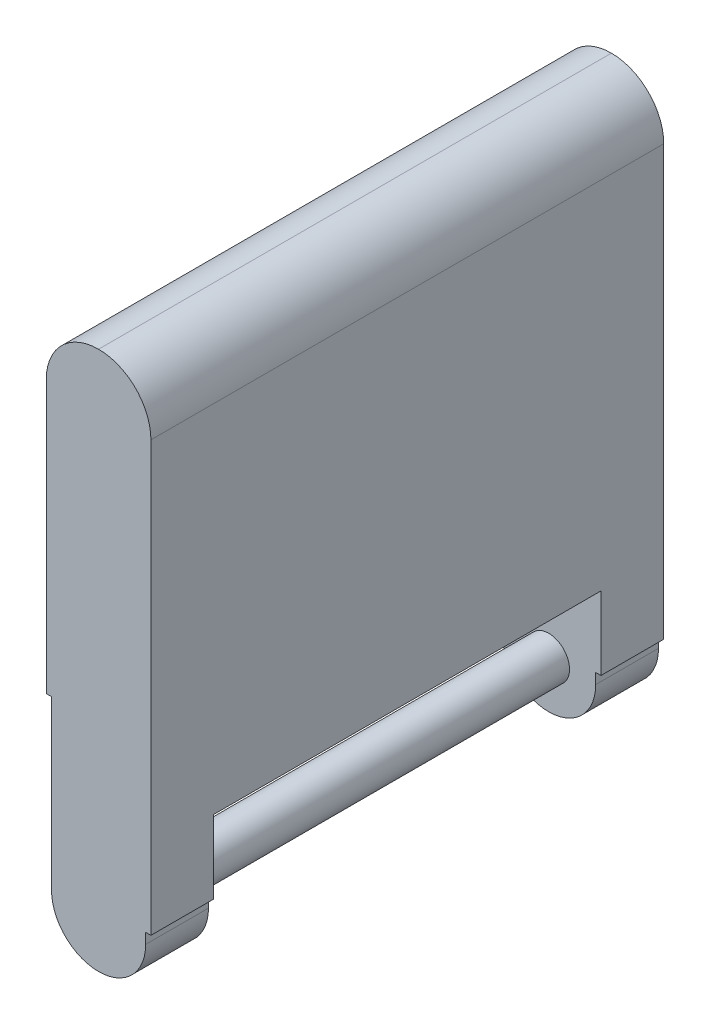
ISO-10303-21;
HEADER;
FILE_DESCRIPTION(('STEP AP214'),'2;1');
FILE_NAME('part.step','',(''),(''),'','','');
FILE_SCHEMA(('AUTOMOTIVE_DESIGN { 1 0 10303 214 1 1 1 1 }'));
ENDSEC;
DATA;
#1=APPLICATION_CONTEXT('core data for automotive mechanical design processes');
#2=APPLICATION_PROTOCOL_DEFINITION('international standard','automotive_design',2000,#1);
#3=PRODUCT_CONTEXT('',#1,'mechanical');
#4=PRODUCT('Part','Part','',(#3));
#5=PRODUCT_RELATED_PRODUCT_CATEGORY('part','',(#4));
#6=PRODUCT_DEFINITION_FORMATION('','',#4);
#7=PRODUCT_DEFINITION_CONTEXT('part definition',#1,'design');
#8=PRODUCT_DEFINITION('design','',#6,#7);
#9=PRODUCT_DEFINITION_SHAPE('','',#8);
#10=(LENGTH_UNIT() NAMED_UNIT(*) SI_UNIT(.MILLI.,.METRE.));
#11=(NAMED_UNIT(*) PLANE_ANGLE_UNIT() SI_UNIT($,.RADIAN.));
#12=(NAMED_UNIT(*) SI_UNIT($,.STERADIAN.) SOLID_ANGLE_UNIT());
#13=UNCERTAINTY_MEASURE_WITH_UNIT(LENGTH_MEASURE(1.E-05),#10,'distance_accuracy_value','');
#14=(GEOMETRIC_REPRESENTATION_CONTEXT(3) GLOBAL_UNCERTAINTY_ASSIGNED_CONTEXT((#13)) GLOBAL_UNIT_ASSIGNED_CONTEXT((#10,
#11,#12)) REPRESENTATION_CONTEXT('',''));
#15=CARTESIAN_POINT('',(0.,0.,0.));
#16=DIRECTION('',(0.,0.,1.));
#17=DIRECTION('',(1.,0.,0.));
#18=AXIS2_PLACEMENT_3D('',#15,#16,#17);
#19=CARTESIAN_POINT('',(-5.,0.,-24.5));
#20=DIRECTION('',(1.,0.,0.));
#21=DIRECTION('',(0.,1.,0.));
#22=AXIS2_PLACEMENT_3D('',#19,#20,#21);
#23=PLANE('',#22);
#24=DIRECTION('',(0.,1.,0.));
#25=VECTOR('',#24,1.);
#26=CARTESIAN_POINT('',(-5.,0.,-24.5));
#27=LINE('',#26,#25);
#28=CARTESIAN_POINT('',(-5.,18.7173913043478,-24.5));
#29=VERTEX_POINT('',#28);
#30=CARTESIAN_POINT('',(-5.,44.7173913043478,-24.5));
#31=VERTEX_POINT('',#30);
#32=EDGE_CURVE('E168',#29,#31,#27,.T.);
#33=ORIENTED_EDGE('',*,*,#32,.F.);
#34=DIRECTION('',(0.,0.,1.));
#35=VECTOR('',#34,1.);
#36=CARTESIAN_POINT('',(-5.,18.7173913043478,-24.5));
#37=LINE('',#36,#35);
#38=CARTESIAN_POINT('',(-5.,18.7173913043478,24.5));
#39=VERTEX_POINT('',#38);
#40=EDGE_CURVE('E231',#29,#39,#37,.T.);
#41=ORIENTED_EDGE('',*,*,#40,.T.);
#42=DIRECTION('',(0.,1.,0.));
#43=VECTOR('',#42,1.);
#44=CARTESIAN_POINT('',(-5.,0.,24.5));
#45=LINE('',#44,#43);
#46=CARTESIAN_POINT('',(-5.,44.7173913043478,24.5));
#47=VERTEX_POINT('',#46);
#48=EDGE_CURVE('E169',#39,#47,#45,.T.);
#49=ORIENTED_EDGE('',*,*,#48,.T.);
#50=DIRECTION('',(0.,0.,1.));
#51=VECTOR('',#50,1.);
#52=CARTESIAN_POINT('',(-5.,44.7173913043478,-24.5));
#53=LINE('',#52,#51);
#54=EDGE_CURVE('E189',#47,#31,#53,.F.);
#55=ORIENTED_EDGE('',*,*,#54,.T.);
#56=EDGE_LOOP('',(#33,#41,#49,#55));
#57=FACE_BOUND('',#56,.T.);
#58=ADVANCED_FACE('F33',(#57),#23,.F.);
#59=CARTESIAN_POINT('',(5.,0.,-24.5));
#60=DIRECTION('',(-1.,0.,0.));
#61=DIRECTION('',(0.,-1.,0.));
#62=AXIS2_PLACEMENT_3D('',#59,#60,#61);
#63=PLANE('',#62);
#64=DIRECTION('',(0.,-1.,0.));
#65=VECTOR('',#64,1.);
#66=CARTESIAN_POINT('',(5.,0.,24.5));
#67=LINE('',#66,#65);
#68=CARTESIAN_POINT('',(5.,44.7173913043478,24.5));
#69=VERTEX_POINT('',#68);
#70=CARTESIAN_POINT('',(5.,3.71739130434785,24.5));
#71=VERTEX_POINT('',#70);
#72=EDGE_CURVE('E173',#69,#71,#67,.T.);
#73=ORIENTED_EDGE('',*,*,#72,.T.);
#74=DIRECTION('',(0.,0.,1.));
#75=VECTOR('',#74,1.);
#76=CARTESIAN_POINT('',(5.,3.71739130434785,-24.5));
#77=LINE('',#76,#75);
#78=CARTESIAN_POINT('',(5.,3.71739130434785,18.5));
#79=VERTEX_POINT('',#78);
#80=EDGE_CURVE('E162',#79,#71,#77,.T.);
#81=ORIENTED_EDGE('',*,*,#80,.F.);
#82=DIRECTION('',(0.,1.,0.));
#83=VECTOR('',#82,1.);
#84=CARTESIAN_POINT('',(5.,0.,18.5));
#85=LINE('',#84,#83);
#86=CARTESIAN_POINT('',(5.,10.7173913043478,18.5));
#87=VERTEX_POINT('',#86);
#88=EDGE_CURVE('E243',#79,#87,#85,.T.);
#89=ORIENTED_EDGE('',*,*,#88,.T.);
#90=DIRECTION('',(0.,0.,1.));
#91=VECTOR('',#90,1.);
#92=CARTESIAN_POINT('',(5.,10.7173913043478,-18.5));
#93=LINE('',#92,#91);
#94=CARTESIAN_POINT('',(5.,10.7173913043478,-18.5));
#95=VERTEX_POINT('',#94);
#96=EDGE_CURVE('E176',#95,#87,#93,.T.);
#97=ORIENTED_EDGE('',*,*,#96,.F.);
#98=DIRECTION('',(0.,1.,0.));
#99=VECTOR('',#98,1.);
#100=CARTESIAN_POINT('',(5.,0.,-18.5));
#101=LINE('',#100,#99);
#102=CARTESIAN_POINT('',(5.,3.71739130434785,-18.5));
#103=VERTEX_POINT('',#102);
#104=EDGE_CURVE('E161',#103,#95,#101,.T.);
#105=ORIENTED_EDGE('',*,*,#104,.F.);
#106=CARTESIAN_POINT('',(5.,3.71739130434785,-24.5));
#107=VERTEX_POINT('',#106);
#108=EDGE_CURVE('E142',#107,#103,#77,.T.);
#109=ORIENTED_EDGE('',*,*,#108,.F.);
#110=DIRECTION('',(0.,-1.,0.));
#111=VECTOR('',#110,1.);
#112=CARTESIAN_POINT('',(5.,0.,-24.5));
#113=LINE('',#112,#111);
#114=CARTESIAN_POINT('',(5.,44.7173913043478,-24.5));
#115=VERTEX_POINT('',#114);
#116=EDGE_CURVE('E158',#115,#107,#113,.T.);
#117=ORIENTED_EDGE('',*,*,#116,.F.);
#118=DIRECTION('',(0.,0.,1.));
#119=VECTOR('',#118,1.);
#120=CARTESIAN_POINT('',(5.,44.7173913043478,-24.5));
#121=LINE('',#120,#119);
#122=EDGE_CURVE('E185',#115,#69,#121,.T.);
#123=ORIENTED_EDGE('',*,*,#122,.T.);
#124=EDGE_LOOP('',(#73,#81,#89,#97,#105,#109,#117,#123));
#125=FACE_BOUND('',#124,.T.);
#126=ADVANCED_FACE('F156',(#125),#63,.F.);
#127=CARTESIAN_POINT('',(0.,0.,-24.5));
#128=DIRECTION('',(0.,0.,1.));
#129=DIRECTION('',(1.,0.,0.));
#130=AXIS2_PLACEMENT_3D('',#127,#128,#129);
#131=PLANE('',#130);
#132=DIRECTION('',(0.,1.,0.));
#133=VECTOR('',#132,1.);
#134=CARTESIAN_POINT('',(-4.5,2.71739130434784,-24.5));
#135=LINE('',#134,#133);
#136=CARTESIAN_POINT('',(-4.5,2.71739130434784,-24.5));
#137=VERTEX_POINT('',#136);
#138=CARTESIAN_POINT('',(-4.5,18.7173913043478,-24.5));
#139=VERTEX_POINT('',#138);
#140=EDGE_CURVE('E259',#137,#139,#135,.T.);
#141=ORIENTED_EDGE('',*,*,#140,.T.);
#142=DIRECTION('',(-1.,0.,0.));
#143=VECTOR('',#142,1.);
#144=CARTESIAN_POINT('',(-4.5,18.7173913043478,-24.5));
#145=LINE('',#144,#143);
#146=EDGE_CURVE('E257',#139,#29,#145,.T.);
#147=ORIENTED_EDGE('',*,*,#146,.T.);
#148=ORIENTED_EDGE('',*,*,#32,.T.);
#149=CARTESIAN_POINT('',(0.,44.7173913043478,-24.5));
#150=DIRECTION('',(0.,0.,1.));
#151=DIRECTION('',(1.,0.,0.));
#152=AXIS2_PLACEMENT_3D('',#149,#150,#151);
#153=CIRCLE('',#152,5.);
#154=CARTESIAN_POINT('',(0.,49.7173913043478,-24.5));
#155=VERTEX_POINT('',#154);
#156=EDGE_CURVE('E56',#31,#155,#153,.F.);
#157=ORIENTED_EDGE('',*,*,#156,.T.);
#158=CARTESIAN_POINT('',(0.,44.7173913043478,-24.5));
#159=DIRECTION('',(0.,0.,1.));
#160=DIRECTION('',(1.,0.,0.));
#161=AXIS2_PLACEMENT_3D('',#158,#159,#160);
#162=CIRCLE('',#161,5.);
#163=EDGE_CURVE('E167',#155,#115,#162,.F.);
#164=ORIENTED_EDGE('',*,*,#163,.T.);
#165=ORIENTED_EDGE('',*,*,#116,.T.);
#166=DIRECTION('',(-1.,0.,0.));
#167=VECTOR('',#166,1.);
#168=CARTESIAN_POINT('',(4.5,3.71739130434785,-24.5));
#169=LINE('',#168,#167);
#170=CARTESIAN_POINT('',(4.5,3.71739130434785,-24.5));
#171=VERTEX_POINT('',#170);
#172=EDGE_CURVE('E139',#107,#171,#169,.T.);
#173=ORIENTED_EDGE('',*,*,#172,.T.);
#174=DIRECTION('',(0.,-1.,0.));
#175=VECTOR('',#174,1.);
#176=CARTESIAN_POINT('',(4.5,3.71739130434785,-24.5));
#177=LINE('',#176,#175);
#178=CARTESIAN_POINT('',(4.5,2.71739130434785,-24.5));
#179=VERTEX_POINT('',#178);
#180=EDGE_CURVE('E149',#171,#179,#177,.T.);
#181=ORIENTED_EDGE('',*,*,#180,.T.);
#182=CARTESIAN_POINT('',(0.,2.71739130434785,-24.5));
#183=DIRECTION('',(0.,0.,-1.));
#184=DIRECTION('',(1.,0.,0.));
#185=AXIS2_PLACEMENT_3D('',#182,#183,#184);
#186=CIRCLE('',#185,4.5);
#187=EDGE_CURVE('E263',#179,#137,#186,.T.);
#188=ORIENTED_EDGE('',*,*,#187,.T.);
#189=EDGE_LOOP('',(#141,#147,#148,#157,#164,#165,#173,#181,#188));
#190=FACE_BOUND('',#189,.T.);
#191=ADVANCED_FACE('F165',(#190),#131,.F.);
#192=CARTESIAN_POINT('',(0.,0.,24.5));
#193=DIRECTION('',(0.,0.,1.));
#194=DIRECTION('',(1.,0.,0.));
#195=AXIS2_PLACEMENT_3D('',#192,#193,#194);
#196=PLANE('',#195);
#197=DIRECTION('',(-1.,0.,0.));
#198=VECTOR('',#197,1.);
#199=CARTESIAN_POINT('',(-4.5,18.7173913043478,24.5));
#200=LINE('',#199,#198);
#201=CARTESIAN_POINT('',(-4.5,18.7173913043478,24.5));
#202=VERTEX_POINT('',#201);
#203=EDGE_CURVE('E150',#202,#39,#200,.T.);
#204=ORIENTED_EDGE('',*,*,#203,.F.);
#205=DIRECTION('',(0.,1.,0.));
#206=VECTOR('',#205,1.);
#207=CARTESIAN_POINT('',(-4.5,2.71739130434784,24.5));
#208=LINE('',#207,#206);
#209=CARTESIAN_POINT('',(-4.5,2.71739130434784,24.5));
#210=VERTEX_POINT('',#209);
#211=EDGE_CURVE('E272',#210,#202,#208,.T.);
#212=ORIENTED_EDGE('',*,*,#211,.F.);
#213=CARTESIAN_POINT('',(0.,2.71739130434785,24.5));
#214=DIRECTION('',(0.,0.,-1.));
#215=DIRECTION('',(1.,0.,0.));
#216=AXIS2_PLACEMENT_3D('',#213,#214,#215);
#217=CIRCLE('',#216,4.5);
#218=CARTESIAN_POINT('',(4.5,2.71739130434785,24.5));
#219=VERTEX_POINT('',#218);
#220=EDGE_CURVE('E270',#219,#210,#217,.T.);
#221=ORIENTED_EDGE('',*,*,#220,.F.);
#222=DIRECTION('',(0.,-1.,0.));
#223=VECTOR('',#222,1.);
#224=CARTESIAN_POINT('',(4.5,3.71739130434785,24.5));
#225=LINE('',#224,#223);
#226=CARTESIAN_POINT('',(4.5,3.71739130434785,24.5));
#227=VERTEX_POINT('',#226);
#228=EDGE_CURVE('E218',#227,#219,#225,.T.);
#229=ORIENTED_EDGE('',*,*,#228,.F.);
#230=DIRECTION('',(-1.,0.,0.));
#231=VECTOR('',#230,1.);
#232=CARTESIAN_POINT('',(4.5,3.71739130434785,24.5));
#233=LINE('',#232,#231);
#234=EDGE_CURVE('E267',#71,#227,#233,.T.);
#235=ORIENTED_EDGE('',*,*,#234,.F.);
#236=ORIENTED_EDGE('',*,*,#72,.F.);
#237=CARTESIAN_POINT('',(0.,44.7173913043478,24.5));
#238=DIRECTION('',(0.,0.,1.));
#239=DIRECTION('',(1.,0.,0.));
#240=AXIS2_PLACEMENT_3D('',#237,#238,#239);
#241=CIRCLE('',#240,5.);
#242=CARTESIAN_POINT('',(0.,49.7173913043478,24.5));
#243=VERTEX_POINT('',#242);
#244=EDGE_CURVE('E183',#69,#243,#241,.T.);
#245=ORIENTED_EDGE('',*,*,#244,.T.);
#246=CARTESIAN_POINT('',(0.,44.7173913043478,24.5));
#247=DIRECTION('',(0.,0.,1.));
#248=DIRECTION('',(1.,0.,0.));
#249=AXIS2_PLACEMENT_3D('',#246,#247,#248);
#250=CIRCLE('',#249,5.);
#251=EDGE_CURVE('E171',#243,#47,#250,.T.);
#252=ORIENTED_EDGE('',*,*,#251,.T.);
#253=ORIENTED_EDGE('',*,*,#48,.F.);
#254=EDGE_LOOP('',(#204,#212,#221,#229,#235,#236,#245,#252,#253));
#255=FACE_BOUND('',#254,.T.);
#256=ADVANCED_FACE('F287',(#255),#196,.T.);
#257=CARTESIAN_POINT('',(0.,44.7173913043478,-24.5));
#258=DIRECTION('',(0.,0.,1.));
#259=DIRECTION('',(1.,0.,0.));
#260=AXIS2_PLACEMENT_3D('',#257,#258,#259);
#261=CYLINDRICAL_SURFACE('',#260,5.);
#262=DIRECTION('',(0.,0.,1.));
#263=VECTOR('',#262,1.);
#264=CARTESIAN_POINT('',(0.,49.7173913043478,-24.5));
#265=LINE('',#264,#263);
#266=EDGE_CURVE('E179',#155,#243,#265,.T.);
#267=ORIENTED_EDGE('',*,*,#266,.F.);
#268=ORIENTED_EDGE('',*,*,#156,.F.);
#269=ORIENTED_EDGE('',*,*,#54,.F.);
#270=ORIENTED_EDGE('',*,*,#251,.F.);
#271=EDGE_LOOP('',(#267,#268,#269,#270));
#272=FACE_BOUND('',#271,.T.);
#273=ADVANCED_FACE('F35',(#272),#261,.T.);
#274=CARTESIAN_POINT('',(0.,44.7173913043478,-24.5));
#275=DIRECTION('',(0.,0.,1.));
#276=DIRECTION('',(1.,0.,0.));
#277=AXIS2_PLACEMENT_3D('',#274,#275,#276);
#278=CYLINDRICAL_SURFACE('',#277,5.);
#279=ORIENTED_EDGE('',*,*,#163,.F.);
#280=ORIENTED_EDGE('',*,*,#266,.T.);
#281=ORIENTED_EDGE('',*,*,#244,.F.);
#282=ORIENTED_EDGE('',*,*,#122,.F.);
#283=EDGE_LOOP('',(#279,#280,#281,#282));
#284=FACE_BOUND('',#283,.T.);
#285=ADVANCED_FACE('F295',(#284),#278,.T.);
#286=CARTESIAN_POINT('',(0.,10.7173913043478,-18.5));
#287=DIRECTION('',(0.,1.,0.));
#288=DIRECTION('',(0.,0.,1.));
#289=AXIS2_PLACEMENT_3D('',#286,#287,#288);
#290=PLANE('',#289);
#291=DIRECTION('',(-1.,0.,0.));
#292=VECTOR('',#291,1.);
#293=CARTESIAN_POINT('',(0.,10.7173913043478,18.5));
#294=LINE('',#293,#292);
#295=CARTESIAN_POINT('',(-4.5,10.7173913043478,18.5));
#296=VERTEX_POINT('',#295);
#297=EDGE_CURVE('E246',#87,#296,#294,.T.);
#298=ORIENTED_EDGE('',*,*,#297,.T.);
#299=DIRECTION('',(0.,0.,-1.));
#300=VECTOR('',#299,1.);
#301=CARTESIAN_POINT('',(-4.5,10.7173913043478,-18.5));
#302=LINE('',#301,#300);
#303=CARTESIAN_POINT('',(-4.5,10.7173913043478,-18.5));
#304=VERTEX_POINT('',#303);
#305=EDGE_CURVE('E235',#296,#304,#302,.T.);
#306=ORIENTED_EDGE('',*,*,#305,.T.);
#307=DIRECTION('',(-1.,0.,0.));
#308=VECTOR('',#307,1.);
#309=CARTESIAN_POINT('',(0.,10.7173913043478,-18.5));
#310=LINE('',#309,#308);
#311=EDGE_CURVE('E245',#95,#304,#310,.T.);
#312=ORIENTED_EDGE('',*,*,#311,.F.);
#313=ORIENTED_EDGE('',*,*,#96,.T.);
#314=EDGE_LOOP('',(#298,#306,#312,#313));
#315=FACE_BOUND('',#314,.T.);
#316=ADVANCED_FACE('F251',(#315),#290,.F.);
#317=CARTESIAN_POINT('',(0.,0.,-18.5));
#318=DIRECTION('',(0.,0.,1.));
#319=DIRECTION('',(1.,0.,0.));
#320=AXIS2_PLACEMENT_3D('',#317,#318,#319);
#321=PLANE('',#320);
#322=DIRECTION('',(0.,1.,0.));
#323=VECTOR('',#322,1.);
#324=CARTESIAN_POINT('',(-4.5,0.,-18.5));
#325=LINE('',#324,#323);
#326=CARTESIAN_POINT('',(-4.5,2.71739130434784,-18.5));
#327=VERTEX_POINT('',#326);
#328=EDGE_CURVE('E238',#327,#304,#325,.T.);
#329=ORIENTED_EDGE('',*,*,#328,.F.);
#330=CARTESIAN_POINT('',(0.,2.71739130434785,-18.5));
#331=DIRECTION('',(0.,0.,1.));
#332=DIRECTION('',(1.,0.,0.));
#333=AXIS2_PLACEMENT_3D('',#330,#331,#332);
#334=CIRCLE('',#333,4.5);
#335=CARTESIAN_POINT('',(4.5,2.71739130434785,-18.5));
#336=VERTEX_POINT('',#335);
#337=EDGE_CURVE('E233',#336,#327,#334,.F.);
#338=ORIENTED_EDGE('',*,*,#337,.F.);
#339=DIRECTION('',(0.,-1.,0.));
#340=VECTOR('',#339,1.);
#341=CARTESIAN_POINT('',(4.5,0.,-18.5));
#342=LINE('',#341,#340);
#343=CARTESIAN_POINT('',(4.5,3.71739130434785,-18.5));
#344=VERTEX_POINT('',#343);
#345=EDGE_CURVE('E230',#344,#336,#342,.T.);
#346=ORIENTED_EDGE('',*,*,#345,.F.);
#347=DIRECTION('',(-1.,0.,0.));
#348=VECTOR('',#347,1.);
#349=CARTESIAN_POINT('',(0.,3.71739130434784,-18.5));
#350=LINE('',#349,#348);
#351=EDGE_CURVE('E228',#103,#344,#350,.T.);
#352=ORIENTED_EDGE('',*,*,#351,.F.);
#353=ORIENTED_EDGE('',*,*,#104,.T.);
#354=ORIENTED_EDGE('',*,*,#311,.T.);
#355=EDGE_LOOP('',(#329,#338,#346,#352,#353,#354));
#356=FACE_BOUND('',#355,.T.);
#357=CARTESIAN_POINT('',(0.,2.71739130434785,-18.5));
#358=DIRECTION('',(0.,0.,1.));
#359=DIRECTION('',(1.,0.,0.));
#360=AXIS2_PLACEMENT_3D('',#357,#358,#359);
#361=CIRCLE('',#360,2.);
#362=CARTESIAN_POINT('',(2.,2.71739130434785,-18.5));
#363=VERTEX_POINT('',#362);
#364=EDGE_CURVE('E240',#363,#363,#361,.T.);
#365=ORIENTED_EDGE('',*,*,#364,.F.);
#366=EDGE_LOOP('',(#365));
#367=FACE_BOUND('',#366,.T.);
#368=ADVANCED_FACE('F321',(#356,#367),#321,.T.);
#369=CARTESIAN_POINT('',(0.,0.,18.5));
#370=DIRECTION('',(0.,0.,1.));
#371=DIRECTION('',(1.,0.,0.));
#372=AXIS2_PLACEMENT_3D('',#369,#370,#371);
#373=PLANE('',#372);
#374=CARTESIAN_POINT('',(0.,2.71739130434785,18.5));
#375=DIRECTION('',(0.,0.,1.));
#376=DIRECTION('',(1.,0.,0.));
#377=AXIS2_PLACEMENT_3D('',#374,#375,#376);
#378=CIRCLE('',#377,2.);
#379=CARTESIAN_POINT('',(2.,2.71739130434785,18.5));
#380=VERTEX_POINT('',#379);
#381=EDGE_CURVE('E192',#380,#380,#378,.F.);
#382=ORIENTED_EDGE('',*,*,#381,.F.);
#383=EDGE_LOOP('',(#382));
#384=FACE_BOUND('',#383,.T.);
#385=CARTESIAN_POINT('',(0.,2.71739130434785,18.5));
#386=DIRECTION('',(0.,0.,1.));
#387=DIRECTION('',(1.,0.,0.));
#388=AXIS2_PLACEMENT_3D('',#385,#386,#387);
#389=CIRCLE('',#388,4.5);
#390=CARTESIAN_POINT('',(4.5,2.71739130434785,18.5));
#391=VERTEX_POINT('',#390);
#392=CARTESIAN_POINT('',(-4.5,2.71739130434784,18.5));
#393=VERTEX_POINT('',#392);
#394=EDGE_CURVE('E41',#391,#393,#389,.F.);
#395=ORIENTED_EDGE('',*,*,#394,.T.);
#396=DIRECTION('',(0.,1.,0.));
#397=VECTOR('',#396,1.);
#398=CARTESIAN_POINT('',(-4.5,0.,18.5));
#399=LINE('',#398,#397);
#400=EDGE_CURVE('E11',#393,#296,#399,.T.);
#401=ORIENTED_EDGE('',*,*,#400,.T.);
#402=ORIENTED_EDGE('',*,*,#297,.F.);
#403=ORIENTED_EDGE('',*,*,#88,.F.);
#404=DIRECTION('',(-1.,0.,0.));
#405=VECTOR('',#404,1.);
#406=CARTESIAN_POINT('',(0.,3.71739130434784,18.5));
#407=LINE('',#406,#405);
#408=CARTESIAN_POINT('',(4.5,3.71739130434785,18.5));
#409=VERTEX_POINT('',#408);
#410=EDGE_CURVE('E197',#79,#409,#407,.T.);
#411=ORIENTED_EDGE('',*,*,#410,.T.);
#412=DIRECTION('',(0.,-1.,0.));
#413=VECTOR('',#412,1.);
#414=CARTESIAN_POINT('',(4.5,0.,18.5));
#415=LINE('',#414,#413);
#416=EDGE_CURVE('E200',#409,#391,#415,.T.);
#417=ORIENTED_EDGE('',*,*,#416,.T.);
#418=EDGE_LOOP('',(#395,#401,#402,#403,#411,#417));
#419=FACE_BOUND('',#418,.T.);
#420=ADVANCED_FACE('F204',(#384,#419),#373,.F.);
#421=CARTESIAN_POINT('',(0.,2.71739130434785,18.5));
#422=DIRECTION('',(0.,0.,-1.));
#423=DIRECTION('',(-1.,0.,0.));
#424=AXIS2_PLACEMENT_3D('',#421,#422,#423);
#425=CYLINDRICAL_SURFACE('',#424,2.);
#426=ORIENTED_EDGE('',*,*,#381,.T.);
#427=EDGE_LOOP('',(#426));
#428=FACE_BOUND('',#427,.T.);
#429=ORIENTED_EDGE('',*,*,#364,.T.);
#430=EDGE_LOOP('',(#429));
#431=FACE_BOUND('',#430,.T.);
#432=ADVANCED_FACE('F334',(#428,#431),#425,.T.);
#433=CARTESIAN_POINT('',(0.,2.71739130434785,-24.5));
#434=DIRECTION('',(0.,0.,1.));
#435=DIRECTION('',(1.,0.,0.));
#436=AXIS2_PLACEMENT_3D('',#433,#434,#435);
#437=CYLINDRICAL_SURFACE('',#436,4.5);
#438=DIRECTION('',(0.,0.,1.));
#439=VECTOR('',#438,1.);
#440=CARTESIAN_POINT('',(4.5,2.71739130434785,-24.5));
#441=LINE('',#440,#439);
#442=EDGE_CURVE('E212',#391,#219,#441,.T.);
#443=ORIENTED_EDGE('',*,*,#442,.T.);
#444=ORIENTED_EDGE('',*,*,#220,.T.);
#445=DIRECTION('',(0.,0.,1.));
#446=VECTOR('',#445,1.);
#447=CARTESIAN_POINT('',(-4.5,2.71739130434784,-24.5));
#448=LINE('',#447,#446);
#449=EDGE_CURVE('E214',#393,#210,#448,.T.);
#450=ORIENTED_EDGE('',*,*,#449,.F.);
#451=ORIENTED_EDGE('',*,*,#394,.F.);
#452=EDGE_LOOP('',(#443,#444,#450,#451));
#453=FACE_BOUND('',#452,.T.);
#454=ADVANCED_FACE('F210',(#453),#437,.T.);
#455=CARTESIAN_POINT('',(4.5,3.71739130434785,-24.5));
#456=DIRECTION('',(-1.,0.,0.));
#457=DIRECTION('',(0.,0.,1.));
#458=AXIS2_PLACEMENT_3D('',#455,#456,#457);
#459=PLANE('',#458);
#460=DIRECTION('',(0.,0.,1.));
#461=VECTOR('',#460,1.);
#462=CARTESIAN_POINT('',(4.5,3.71739130434785,-24.5));
#463=LINE('',#462,#461);
#464=EDGE_CURVE('E48',#409,#227,#463,.T.);
#465=ORIENTED_EDGE('',*,*,#464,.T.);
#466=ORIENTED_EDGE('',*,*,#228,.T.);
#467=ORIENTED_EDGE('',*,*,#442,.F.);
#468=ORIENTED_EDGE('',*,*,#416,.F.);
#469=EDGE_LOOP('',(#465,#466,#467,#468));
#470=FACE_BOUND('',#469,.T.);
#471=ADVANCED_FACE('F216',(#470),#459,.F.);
#472=CARTESIAN_POINT('',(4.5,3.71739130434785,-24.5));
#473=DIRECTION('',(0.,1.,0.));
#474=DIRECTION('',(-1.,0.,0.));
#475=AXIS2_PLACEMENT_3D('',#472,#473,#474);
#476=PLANE('',#475);
#477=ORIENTED_EDGE('',*,*,#80,.T.);
#478=ORIENTED_EDGE('',*,*,#234,.T.);
#479=ORIENTED_EDGE('',*,*,#464,.F.);
#480=ORIENTED_EDGE('',*,*,#410,.F.);
#481=EDGE_LOOP('',(#477,#478,#479,#480));
#482=FACE_BOUND('',#481,.T.);
#483=ADVANCED_FACE('F296',(#482),#476,.F.);
#484=CARTESIAN_POINT('',(-4.5,18.7173913043478,-24.5));
#485=DIRECTION('',(0.,1.,0.));
#486=DIRECTION('',(0.,0.,1.));
#487=AXIS2_PLACEMENT_3D('',#484,#485,#486);
#488=PLANE('',#487);
#489=ORIENTED_EDGE('',*,*,#203,.T.);
#490=ORIENTED_EDGE('',*,*,#40,.F.);
#491=ORIENTED_EDGE('',*,*,#146,.F.);
#492=DIRECTION('',(0.,0.,1.));
#493=VECTOR('',#492,1.);
#494=CARTESIAN_POINT('',(-4.5,18.7173913043478,-24.5));
#495=LINE('',#494,#493);
#496=EDGE_CURVE('E277',#139,#202,#495,.T.);
#497=ORIENTED_EDGE('',*,*,#496,.T.);
#498=EDGE_LOOP('',(#489,#490,#491,#497));
#499=FACE_BOUND('',#498,.T.);
#500=ADVANCED_FACE('F289',(#499),#488,.F.);
#501=CARTESIAN_POINT('',(-4.5,2.71739130434784,-24.5));
#502=DIRECTION('',(1.,0.,0.));
#503=DIRECTION('',(0.,1.,0.));
#504=AXIS2_PLACEMENT_3D('',#501,#502,#503);
#505=PLANE('',#504);
#506=ORIENTED_EDGE('',*,*,#328,.T.);
#507=ORIENTED_EDGE('',*,*,#305,.F.);
#508=ORIENTED_EDGE('',*,*,#400,.F.);
#509=ORIENTED_EDGE('',*,*,#449,.T.);
#510=ORIENTED_EDGE('',*,*,#211,.T.);
#511=ORIENTED_EDGE('',*,*,#496,.F.);
#512=ORIENTED_EDGE('',*,*,#140,.F.);
#513=EDGE_CURVE('E225',#137,#327,#448,.T.);
#514=ORIENTED_EDGE('',*,*,#513,.T.);
#515=EDGE_LOOP('',(#506,#507,#508,#509,#510,#511,#512,#514));
#516=FACE_BOUND('',#515,.T.);
#517=ADVANCED_FACE('F283',(#516),#505,.F.);
#518=ORIENTED_EDGE('',*,*,#337,.T.);
#519=ORIENTED_EDGE('',*,*,#513,.F.);
#520=ORIENTED_EDGE('',*,*,#187,.F.);
#521=EDGE_CURVE('E220',#179,#336,#441,.T.);
#522=ORIENTED_EDGE('',*,*,#521,.T.);
#523=EDGE_LOOP('',(#518,#519,#520,#522));
#524=FACE_BOUND('',#523,.T.);
#525=ADVANCED_FACE('F344',(#524),#437,.T.);
#526=ORIENTED_EDGE('',*,*,#345,.T.);
#527=ORIENTED_EDGE('',*,*,#521,.F.);
#528=ORIENTED_EDGE('',*,*,#180,.F.);
#529=EDGE_CURVE('E145',#171,#344,#463,.T.);
#530=ORIENTED_EDGE('',*,*,#529,.T.);
#531=EDGE_LOOP('',(#526,#527,#528,#530));
#532=FACE_BOUND('',#531,.T.);
#533=ADVANCED_FACE('F305',(#532),#459,.F.);
#534=ORIENTED_EDGE('',*,*,#351,.T.);
#535=ORIENTED_EDGE('',*,*,#529,.F.);
#536=ORIENTED_EDGE('',*,*,#172,.F.);
#537=ORIENTED_EDGE('',*,*,#108,.T.);
#538=EDGE_LOOP('',(#534,#535,#536,#537));
#539=FACE_BOUND('',#538,.T.);
#540=ADVANCED_FACE('F141',(#539),#476,.F.);
#541=CLOSED_SHELL('',(#58,#126,#191,#256,#273,#285,#316,#368,#420,#432,#454,#471,#483,#500,#517,
#525,#533,#540));
#542=MANIFOLD_SOLID_BREP('B2',#541);
#543=ADVANCED_BREP_SHAPE_REPRESENTATION('',(#18,#542),#14);
#544=SHAPE_DEFINITION_REPRESENTATION(#9,#543);
ENDSEC;
END-ISO-10303-21;
